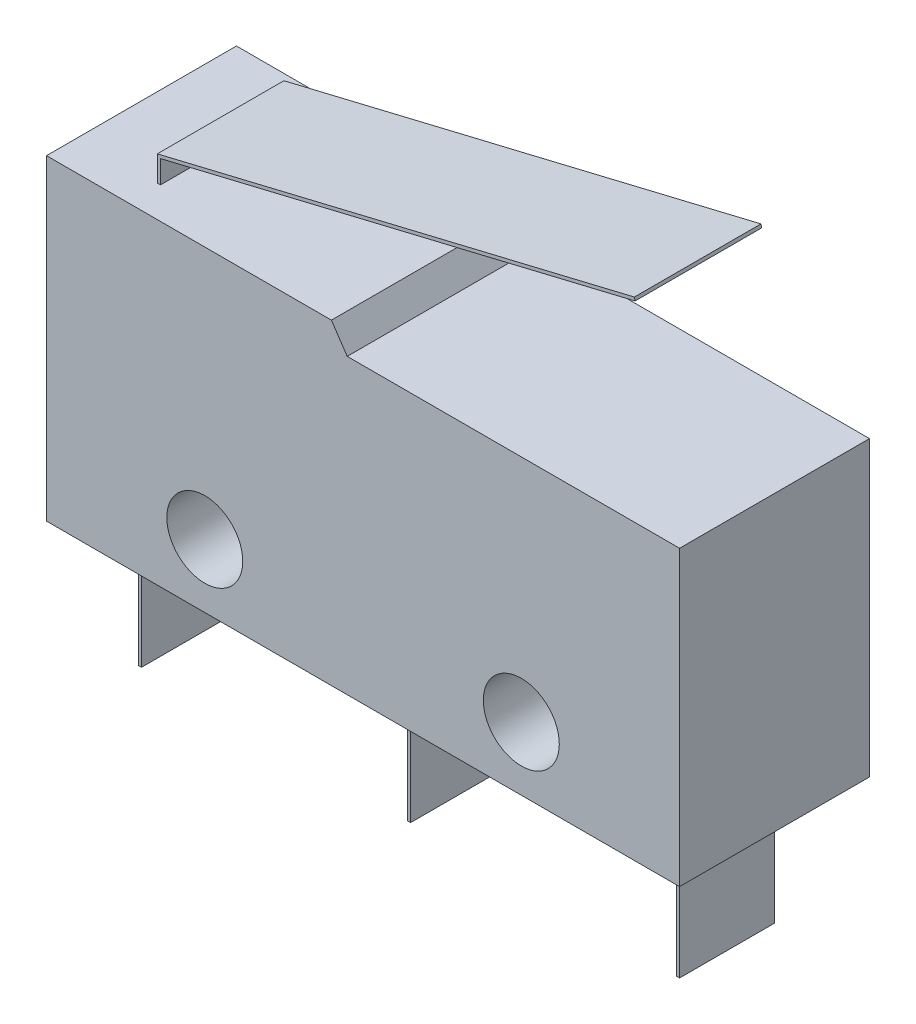
ISO-10303-21;
HEADER;
FILE_DESCRIPTION(('STEP AP214'),'2;1');
FILE_NAME('part.step','',(''),(''),'','','');
FILE_SCHEMA(('AUTOMOTIVE_DESIGN { 1 0 10303 214 1 1 1 1 }'));
ENDSEC;
DATA;
#1=APPLICATION_CONTEXT('core data for automotive mechanical design processes');
#2=APPLICATION_PROTOCOL_DEFINITION('international standard','automotive_design',2000,#1);
#3=PRODUCT_CONTEXT('',#1,'mechanical');
#4=PRODUCT('Part','Part','',(#3));
#5=PRODUCT_RELATED_PRODUCT_CATEGORY('part','',(#4));
#6=PRODUCT_DEFINITION_FORMATION('','',#4);
#7=PRODUCT_DEFINITION_CONTEXT('part definition',#1,'design');
#8=PRODUCT_DEFINITION('design','',#6,#7);
#9=PRODUCT_DEFINITION_SHAPE('','',#8);
#10=(LENGTH_UNIT() NAMED_UNIT(*) SI_UNIT(.MILLI.,.METRE.));
#11=(NAMED_UNIT(*) PLANE_ANGLE_UNIT() SI_UNIT($,.RADIAN.));
#12=(NAMED_UNIT(*) SI_UNIT($,.STERADIAN.) SOLID_ANGLE_UNIT());
#13=UNCERTAINTY_MEASURE_WITH_UNIT(LENGTH_MEASURE(1.E-05),#10,'distance_accuracy_value','');
#14=(GEOMETRIC_REPRESENTATION_CONTEXT(3) GLOBAL_UNCERTAINTY_ASSIGNED_CONTEXT((#13)) GLOBAL_UNIT_ASSIGNED_CONTEXT((#10,
#11,#12)) REPRESENTATION_CONTEXT('',''));
#15=CARTESIAN_POINT('',(0.,0.,0.));
#16=DIRECTION('',(0.,0.,1.));
#17=DIRECTION('',(1.,0.,0.));
#18=AXIS2_PLACEMENT_3D('',#15,#16,#17);
#19=CARTESIAN_POINT('',(0.,-5.,6.));
#20=DIRECTION('',(0.,1.,0.));
#21=DIRECTION('',(0.,0.,1.));
#22=AXIS2_PLACEMENT_3D('',#19,#20,#21);
#23=PLANE('',#22);
#24=DIRECTION('',(0.,0.,1.));
#25=VECTOR('',#24,1.);
#26=CARTESIAN_POINT('',(8.40000000000001,-5.,4.5));
#27=LINE('',#26,#25);
#28=CARTESIAN_POINT('',(8.40000000000001,-5.,4.5));
#29=VERTEX_POINT('',#28);
#30=CARTESIAN_POINT('',(8.40000000000001,-5.,1.5));
#31=VERTEX_POINT('',#30);
#32=EDGE_CURVE('E257',#29,#31,#27,.F.);
#33=ORIENTED_EDGE('',*,*,#32,.F.);
#34=DIRECTION('',(1.,0.,0.));
#35=VECTOR('',#34,1.);
#36=CARTESIAN_POINT('',(8.40000000000001,-5.,4.5));
#37=LINE('',#36,#35);
#38=CARTESIAN_POINT('',(8.50000000000001,-5.,4.5));
#39=VERTEX_POINT('',#38);
#40=EDGE_CURVE('E247',#29,#39,#37,.T.);
#41=ORIENTED_EDGE('',*,*,#40,.T.);
#42=DIRECTION('',(0.,0.,-1.));
#43=VECTOR('',#42,1.);
#44=CARTESIAN_POINT('',(8.50000000000001,-5.,4.5));
#45=LINE('',#44,#43);
#46=CARTESIAN_POINT('',(8.50000000000001,-5.,1.5));
#47=VERTEX_POINT('',#46);
#48=EDGE_CURVE('E65',#39,#47,#45,.T.);
#49=ORIENTED_EDGE('',*,*,#48,.T.);
#50=DIRECTION('',(-1.,0.,0.));
#51=VECTOR('',#50,1.);
#52=CARTESIAN_POINT('',(8.50000000000001,-5.,1.5));
#53=LINE('',#52,#51);
#54=EDGE_CURVE('E260',#47,#31,#53,.T.);
#55=ORIENTED_EDGE('',*,*,#54,.T.);
#56=EDGE_LOOP('',(#33,#41,#49,#55));
#57=FACE_BOUND('',#56,.T.);
#58=DIRECTION('',(1.,0.,0.));
#59=VECTOR('',#58,1.);
#60=CARTESIAN_POINT('',(0.,-5.,0.));
#61=LINE('',#60,#59);
#62=CARTESIAN_POINT('',(-10.,-5.,0.));
#63=VERTEX_POINT('',#62);
#64=CARTESIAN_POINT('',(9.99999999999999,-5.,0.));
#65=VERTEX_POINT('',#64);
#66=EDGE_CURVE('E392',#63,#65,#61,.T.);
#67=ORIENTED_EDGE('',*,*,#66,.T.);
#68=DIRECTION('',(0.,0.,-1.));
#69=VECTOR('',#68,1.);
#70=CARTESIAN_POINT('',(9.99999999999999,-5.,6.));
#71=LINE('',#70,#69);
#72=CARTESIAN_POINT('',(9.99999999999999,-5.,6.));
#73=VERTEX_POINT('',#72);
#74=EDGE_CURVE('E398',#73,#65,#71,.T.);
#75=ORIENTED_EDGE('',*,*,#74,.F.);
#76=DIRECTION('',(1.,0.,0.));
#77=VECTOR('',#76,1.);
#78=CARTESIAN_POINT('',(0.,-5.,6.));
#79=LINE('',#78,#77);
#80=CARTESIAN_POINT('',(-10.,-5.,6.));
#81=VERTEX_POINT('',#80);
#82=EDGE_CURVE('E369',#81,#73,#79,.T.);
#83=ORIENTED_EDGE('',*,*,#82,.F.);
#84=DIRECTION('',(0.,0.,-1.));
#85=VECTOR('',#84,1.);
#86=CARTESIAN_POINT('',(-10.,-5.,6.));
#87=LINE('',#86,#85);
#88=EDGE_CURVE('E400',#81,#63,#87,.T.);
#89=ORIENTED_EDGE('',*,*,#88,.T.);
#90=EDGE_LOOP('',(#67,#75,#83,#89));
#91=FACE_BOUND('',#90,.T.);
#92=DIRECTION('',(0.,0.,1.));
#93=VECTOR('',#92,1.);
#94=CARTESIAN_POINT('',(-0.1,-5.,4.5));
#95=LINE('',#94,#93);
#96=CARTESIAN_POINT('',(-0.1,-5.,4.5));
#97=VERTEX_POINT('',#96);
#98=CARTESIAN_POINT('',(-0.1,-5.,1.5));
#99=VERTEX_POINT('',#98);
#100=EDGE_CURVE('E286',#97,#99,#95,.F.);
#101=ORIENTED_EDGE('',*,*,#100,.F.);
#102=DIRECTION('',(1.,0.,0.));
#103=VECTOR('',#102,1.);
#104=CARTESIAN_POINT('',(-0.1,-5.,4.5));
#105=LINE('',#104,#103);
#106=CARTESIAN_POINT('',(0.,-5.,4.5));
#107=VERTEX_POINT('',#106);
#108=EDGE_CURVE('E276',#97,#107,#105,.T.);
#109=ORIENTED_EDGE('',*,*,#108,.T.);
#110=DIRECTION('',(0.,0.,-1.));
#111=VECTOR('',#110,1.);
#112=CARTESIAN_POINT('',(0.,-5.,4.5));
#113=LINE('',#112,#111);
#114=CARTESIAN_POINT('',(0.,-5.,1.5));
#115=VERTEX_POINT('',#114);
#116=EDGE_CURVE('E292',#107,#115,#113,.T.);
#117=ORIENTED_EDGE('',*,*,#116,.T.);
#118=DIRECTION('',(-1.,0.,0.));
#119=VECTOR('',#118,1.);
#120=CARTESIAN_POINT('',(0.,-5.,1.5));
#121=LINE('',#120,#119);
#122=EDGE_CURVE('E289',#115,#99,#121,.T.);
#123=ORIENTED_EDGE('',*,*,#122,.T.);
#124=EDGE_LOOP('',(#101,#109,#117,#123));
#125=FACE_BOUND('',#124,.T.);
#126=DIRECTION('',(0.,0.,1.));
#127=VECTOR('',#126,1.);
#128=CARTESIAN_POINT('',(-8.60000000000001,-5.,4.5));
#129=LINE('',#128,#127);
#130=CARTESIAN_POINT('',(-8.60000000000001,-5.,4.5));
#131=VERTEX_POINT('',#130);
#132=CARTESIAN_POINT('',(-8.60000000000001,-5.,1.5));
#133=VERTEX_POINT('',#132);
#134=EDGE_CURVE('E219',#131,#133,#129,.F.);
#135=ORIENTED_EDGE('',*,*,#134,.F.);
#136=DIRECTION('',(1.,0.,0.));
#137=VECTOR('',#136,1.);
#138=CARTESIAN_POINT('',(-8.60000000000001,-5.,4.5));
#139=LINE('',#138,#137);
#140=CARTESIAN_POINT('',(-8.50000000000001,-5.,4.5));
#141=VERTEX_POINT('',#140);
#142=EDGE_CURVE('E213',#131,#141,#139,.T.);
#143=ORIENTED_EDGE('',*,*,#142,.T.);
#144=DIRECTION('',(0.,0.,-1.));
#145=VECTOR('',#144,1.);
#146=CARTESIAN_POINT('',(-8.50000000000001,-5.,4.5));
#147=LINE('',#146,#145);
#148=CARTESIAN_POINT('',(-8.50000000000001,-5.,1.5));
#149=VERTEX_POINT('',#148);
#150=EDGE_CURVE('E57',#141,#149,#147,.T.);
#151=ORIENTED_EDGE('',*,*,#150,.T.);
#152=DIRECTION('',(-1.,0.,0.));
#153=VECTOR('',#152,1.);
#154=CARTESIAN_POINT('',(-8.50000000000001,-5.,1.5));
#155=LINE('',#154,#153);
#156=EDGE_CURVE('E234',#149,#133,#155,.T.);
#157=ORIENTED_EDGE('',*,*,#156,.T.);
#158=EDGE_LOOP('',(#135,#143,#151,#157));
#159=FACE_BOUND('',#158,.T.);
#160=ADVANCED_FACE('F42',(#57,#91,#125,#159),#23,.F.);
#161=CARTESIAN_POINT('',(0.,4.25831424670506,6.));
#162=DIRECTION('',(0.,1.,0.));
#163=DIRECTION('',(-1.,0.,0.));
#164=AXIS2_PLACEMENT_3D('',#161,#162,#163);
#165=PLANE('',#164);
#166=DIRECTION('',(1.,0.,0.));
#167=VECTOR('',#166,1.);
#168=CARTESIAN_POINT('',(0.,4.25831424670506,0.));
#169=LINE('',#168,#167);
#170=CARTESIAN_POINT('',(-0.499999999999999,4.25831424670506,0.));
#171=VERTEX_POINT('',#170);
#172=CARTESIAN_POINT('',(9.99999999999999,4.25831424670506,0.));
#173=VERTEX_POINT('',#172);
#174=EDGE_CURVE('E380',#171,#173,#169,.T.);
#175=ORIENTED_EDGE('',*,*,#174,.F.);
#176=DIRECTION('',(0.,0.,-1.));
#177=VECTOR('',#176,1.);
#178=CARTESIAN_POINT('',(-0.499999999999999,4.25831424670506,6.));
#179=LINE('',#178,#177);
#180=CARTESIAN_POINT('',(-0.499999999999999,4.25831424670506,6.));
#181=VERTEX_POINT('',#180);
#182=EDGE_CURVE('E11',#181,#171,#179,.T.);
#183=ORIENTED_EDGE('',*,*,#182,.F.);
#184=DIRECTION('',(1.,0.,0.));
#185=VECTOR('',#184,1.);
#186=CARTESIAN_POINT('',(0.,4.25831424670506,6.));
#187=LINE('',#186,#185);
#188=CARTESIAN_POINT('',(9.99999999999999,4.25831424670506,6.));
#189=VERTEX_POINT('',#188);
#190=EDGE_CURVE('E357',#181,#189,#187,.T.);
#191=ORIENTED_EDGE('',*,*,#190,.T.);
#192=DIRECTION('',(0.,0.,-1.));
#193=VECTOR('',#192,1.);
#194=CARTESIAN_POINT('',(9.99999999999999,4.25831424670506,6.));
#195=LINE('',#194,#193);
#196=EDGE_CURVE('E374',#189,#173,#195,.T.);
#197=ORIENTED_EDGE('',*,*,#196,.T.);
#198=EDGE_LOOP('',(#175,#183,#191,#197));
#199=FACE_BOUND('',#198,.T.);
#200=ADVANCED_FACE('F425',(#199),#165,.T.);
#201=CARTESIAN_POINT('',(1.6299466106144,1.09881213396196,6.));
#202=DIRECTION('',(0.829179221593346,0.558982842740145,0.));
#203=DIRECTION('',(-0.558982842740145,0.829179221593346,0.));
#204=AXIS2_PLACEMENT_3D('',#201,#202,#203);
#205=PLANE('',#204);
#206=DIRECTION('',(0.558982842740145,-0.829179221593346,0.));
#207=VECTOR('',#206,1.);
#208=CARTESIAN_POINT('',(1.6299466106144,1.09881213396196,0.));
#209=LINE('',#208,#207);
#210=CARTESIAN_POINT('',(-0.999999999999999,5.,0.));
#211=VERTEX_POINT('',#210);
#212=EDGE_CURVE('E383',#211,#171,#209,.T.);
#213=ORIENTED_EDGE('',*,*,#212,.F.);
#214=DIRECTION('',(0.,0.,-1.));
#215=VECTOR('',#214,1.);
#216=CARTESIAN_POINT('',(-0.999999999999999,5.,6.));
#217=LINE('',#216,#215);
#218=CARTESIAN_POINT('',(-0.999999999999999,5.,6.));
#219=VERTEX_POINT('',#218);
#220=EDGE_CURVE('E50',#219,#211,#217,.T.);
#221=ORIENTED_EDGE('',*,*,#220,.F.);
#222=DIRECTION('',(0.558982842740145,-0.829179221593346,0.));
#223=VECTOR('',#222,1.);
#224=CARTESIAN_POINT('',(1.6299466106144,1.09881213396196,6.));
#225=LINE('',#224,#223);
#226=EDGE_CURVE('E360',#219,#181,#225,.T.);
#227=ORIENTED_EDGE('',*,*,#226,.T.);
#228=ORIENTED_EDGE('',*,*,#182,.T.);
#229=EDGE_LOOP('',(#213,#221,#227,#228));
#230=FACE_BOUND('',#229,.T.);
#231=ADVANCED_FACE('F411',(#230),#205,.T.);
#232=CARTESIAN_POINT('',(0.,5.,6.));
#233=DIRECTION('',(0.,1.,0.));
#234=DIRECTION('',(0.,0.,1.));
#235=AXIS2_PLACEMENT_3D('',#232,#233,#234);
#236=PLANE('',#235);
#237=DIRECTION('',(-1.,0.,0.));
#238=VECTOR('',#237,1.);
#239=CARTESIAN_POINT('',(-7.40000000000001,5.,1.));
#240=LINE('',#239,#238);
#241=CARTESIAN_POINT('',(-7.40000000000001,5.,1.));
#242=VERTEX_POINT('',#241);
#243=CARTESIAN_POINT('',(-7.50000000000001,5.,1.));
#244=VERTEX_POINT('',#243);
#245=EDGE_CURVE('E314',#242,#244,#240,.T.);
#246=ORIENTED_EDGE('',*,*,#245,.F.);
#247=DIRECTION('',(0.,0.,1.));
#248=VECTOR('',#247,1.);
#249=CARTESIAN_POINT('',(-7.40000000000001,5.,1.));
#250=LINE('',#249,#248);
#251=CARTESIAN_POINT('',(-7.40000000000001,5.,5.));
#252=VERTEX_POINT('',#251);
#253=EDGE_CURVE('E337',#242,#252,#250,.T.);
#254=ORIENTED_EDGE('',*,*,#253,.T.);
#255=DIRECTION('',(-1.,0.,0.));
#256=VECTOR('',#255,1.);
#257=CARTESIAN_POINT('',(-7.40000000000001,5.,5.));
#258=LINE('',#257,#256);
#259=CARTESIAN_POINT('',(-7.50000000000001,5.,5.));
#260=VERTEX_POINT('',#259);
#261=EDGE_CURVE('E329',#252,#260,#258,.T.);
#262=ORIENTED_EDGE('',*,*,#261,.T.);
#263=DIRECTION('',(0.,0.,1.));
#264=VECTOR('',#263,1.);
#265=CARTESIAN_POINT('',(-7.50000000000001,5.,1.));
#266=LINE('',#265,#264);
#267=EDGE_CURVE('E340',#244,#260,#266,.T.);
#268=ORIENTED_EDGE('',*,*,#267,.F.);
#269=EDGE_LOOP('',(#246,#254,#262,#268));
#270=FACE_BOUND('',#269,.T.);
#271=DIRECTION('',(1.,0.,0.));
#272=VECTOR('',#271,1.);
#273=CARTESIAN_POINT('',(0.,5.,0.));
#274=LINE('',#273,#272);
#275=CARTESIAN_POINT('',(-10.,5.,0.));
#276=VERTEX_POINT('',#275);
#277=EDGE_CURVE('E386',#276,#211,#274,.T.);
#278=ORIENTED_EDGE('',*,*,#277,.F.);
#279=DIRECTION('',(0.,0.,-1.));
#280=VECTOR('',#279,1.);
#281=CARTESIAN_POINT('',(-10.,5.,6.));
#282=LINE('',#281,#280);
#283=CARTESIAN_POINT('',(-10.,5.,6.));
#284=VERTEX_POINT('',#283);
#285=EDGE_CURVE('E403',#284,#276,#282,.T.);
#286=ORIENTED_EDGE('',*,*,#285,.F.);
#287=DIRECTION('',(1.,0.,0.));
#288=VECTOR('',#287,1.);
#289=CARTESIAN_POINT('',(0.,5.,6.));
#290=LINE('',#289,#288);
#291=EDGE_CURVE('E363',#284,#219,#290,.T.);
#292=ORIENTED_EDGE('',*,*,#291,.T.);
#293=ORIENTED_EDGE('',*,*,#220,.T.);
#294=EDGE_LOOP('',(#278,#286,#292,#293));
#295=FACE_BOUND('',#294,.T.);
#296=ADVANCED_FACE('F407',(#270,#295),#236,.T.);
#297=CARTESIAN_POINT('',(-10.,0.,6.));
#298=DIRECTION('',(1.,0.,0.));
#299=DIRECTION('',(0.,1.,0.));
#300=AXIS2_PLACEMENT_3D('',#297,#298,#299);
#301=PLANE('',#300);
#302=DIRECTION('',(0.,-1.,0.));
#303=VECTOR('',#302,1.);
#304=CARTESIAN_POINT('',(-10.,0.,0.));
#305=LINE('',#304,#303);
#306=EDGE_CURVE('E389',#276,#63,#305,.T.);
#307=ORIENTED_EDGE('',*,*,#306,.T.);
#308=ORIENTED_EDGE('',*,*,#88,.F.);
#309=DIRECTION('',(0.,-1.,0.));
#310=VECTOR('',#309,1.);
#311=CARTESIAN_POINT('',(-10.,0.,6.));
#312=LINE('',#311,#310);
#313=EDGE_CURVE('E366',#284,#81,#312,.T.);
#314=ORIENTED_EDGE('',*,*,#313,.F.);
#315=ORIENTED_EDGE('',*,*,#285,.T.);
#316=EDGE_LOOP('',(#307,#308,#314,#315));
#317=FACE_BOUND('',#316,.T.);
#318=ADVANCED_FACE('F418',(#317),#301,.F.);
#319=CARTESIAN_POINT('',(-5.,-3.,6.));
#320=DIRECTION('',(0.,0.,-1.));
#321=DIRECTION('',(-1.,0.,0.));
#322=AXIS2_PLACEMENT_3D('',#319,#320,#321);
#323=CYLINDRICAL_SURFACE('',#322,1.2);
#324=CARTESIAN_POINT('',(-5.,-3.,6.));
#325=DIRECTION('',(0.,0.,1.));
#326=DIRECTION('',(1.,0.,0.));
#327=AXIS2_PLACEMENT_3D('',#324,#325,#326);
#328=CIRCLE('',#327,1.2);
#329=CARTESIAN_POINT('',(-3.8,-3.,6.));
#330=VERTEX_POINT('',#329);
#331=EDGE_CURVE('E353',#330,#330,#328,.T.);
#332=ORIENTED_EDGE('',*,*,#331,.T.);
#333=EDGE_LOOP('',(#332));
#334=FACE_BOUND('',#333,.T.);
#335=CARTESIAN_POINT('',(-5.,-3.,0.));
#336=DIRECTION('',(0.,0.,1.));
#337=DIRECTION('',(1.,0.,0.));
#338=AXIS2_PLACEMENT_3D('',#335,#336,#337);
#339=CIRCLE('',#338,1.2);
#340=CARTESIAN_POINT('',(-3.8,-3.,0.));
#341=VERTEX_POINT('',#340);
#342=EDGE_CURVE('E377',#341,#341,#339,.T.);
#343=ORIENTED_EDGE('',*,*,#342,.F.);
#344=EDGE_LOOP('',(#343));
#345=FACE_BOUND('',#344,.T.);
#346=ADVANCED_FACE('F530',(#334,#345),#323,.F.);
#347=CARTESIAN_POINT('',(5.,-3.,6.));
#348=DIRECTION('',(0.,0.,-1.));
#349=DIRECTION('',(-1.,0.,0.));
#350=AXIS2_PLACEMENT_3D('',#347,#348,#349);
#351=CYLINDRICAL_SURFACE('',#350,1.2);
#352=CARTESIAN_POINT('',(5.,-3.,6.));
#353=DIRECTION('',(0.,0.,1.));
#354=DIRECTION('',(1.,0.,0.));
#355=AXIS2_PLACEMENT_3D('',#352,#353,#354);
#356=CIRCLE('',#355,1.2);
#357=CARTESIAN_POINT('',(6.2,-3.,6.));
#358=VERTEX_POINT('',#357);
#359=EDGE_CURVE('E350',#358,#358,#356,.T.);
#360=ORIENTED_EDGE('',*,*,#359,.T.);
#361=EDGE_LOOP('',(#360));
#362=FACE_BOUND('',#361,.T.);
#363=CARTESIAN_POINT('',(5.,-3.,0.));
#364=DIRECTION('',(0.,0.,1.));
#365=DIRECTION('',(1.,0.,0.));
#366=AXIS2_PLACEMENT_3D('',#363,#364,#365);
#367=CIRCLE('',#366,1.2);
#368=CARTESIAN_POINT('',(6.2,-3.,0.));
#369=VERTEX_POINT('',#368);
#370=EDGE_CURVE('E336',#369,#369,#367,.T.);
#371=ORIENTED_EDGE('',*,*,#370,.F.);
#372=EDGE_LOOP('',(#371));
#373=FACE_BOUND('',#372,.T.);
#374=ADVANCED_FACE('F44',(#362,#373),#351,.F.);
#375=CARTESIAN_POINT('',(9.99999999999999,0.,6.));
#376=DIRECTION('',(1.,0.,0.));
#377=DIRECTION('',(0.,1.,0.));
#378=AXIS2_PLACEMENT_3D('',#375,#376,#377);
#379=PLANE('',#378);
#380=DIRECTION('',(0.,-1.,0.));
#381=VECTOR('',#380,1.);
#382=CARTESIAN_POINT('',(9.99999999999999,0.,0.));
#383=LINE('',#382,#381);
#384=EDGE_CURVE('E354',#173,#65,#383,.T.);
#385=ORIENTED_EDGE('',*,*,#384,.F.);
#386=ORIENTED_EDGE('',*,*,#196,.F.);
#387=DIRECTION('',(0.,-1.,0.));
#388=VECTOR('',#387,1.);
#389=CARTESIAN_POINT('',(9.99999999999999,0.,6.));
#390=LINE('',#389,#388);
#391=EDGE_CURVE('E371',#189,#73,#390,.T.);
#392=ORIENTED_EDGE('',*,*,#391,.T.);
#393=ORIENTED_EDGE('',*,*,#74,.T.);
#394=EDGE_LOOP('',(#385,#386,#392,#393));
#395=FACE_BOUND('',#394,.T.);
#396=ADVANCED_FACE('F428',(#395),#379,.T.);
#397=CARTESIAN_POINT('',(0.,0.,6.));
#398=DIRECTION('',(0.,0.,1.));
#399=DIRECTION('',(1.,0.,0.));
#400=AXIS2_PLACEMENT_3D('',#397,#398,#399);
#401=PLANE('',#400);
#402=ORIENTED_EDGE('',*,*,#359,.F.);
#403=EDGE_LOOP('',(#402));
#404=FACE_BOUND('',#403,.T.);
#405=ORIENTED_EDGE('',*,*,#331,.F.);
#406=EDGE_LOOP('',(#405));
#407=FACE_BOUND('',#406,.T.);
#408=ORIENTED_EDGE('',*,*,#190,.F.);
#409=ORIENTED_EDGE('',*,*,#226,.F.);
#410=ORIENTED_EDGE('',*,*,#291,.F.);
#411=ORIENTED_EDGE('',*,*,#313,.T.);
#412=ORIENTED_EDGE('',*,*,#82,.T.);
#413=ORIENTED_EDGE('',*,*,#391,.F.);
#414=EDGE_LOOP('',(#408,#409,#410,#411,#412,#413));
#415=FACE_BOUND('',#414,.T.);
#416=ADVANCED_FACE('F422',(#404,#407,#415),#401,.T.);
#417=CARTESIAN_POINT('',(0.,0.,0.));
#418=DIRECTION('',(0.,0.,1.));
#419=DIRECTION('',(1.,0.,0.));
#420=AXIS2_PLACEMENT_3D('',#417,#418,#419);
#421=PLANE('',#420);
#422=ORIENTED_EDGE('',*,*,#370,.T.);
#423=EDGE_LOOP('',(#422));
#424=FACE_BOUND('',#423,.T.);
#425=ORIENTED_EDGE('',*,*,#342,.T.);
#426=EDGE_LOOP('',(#425));
#427=FACE_BOUND('',#426,.T.);
#428=ORIENTED_EDGE('',*,*,#174,.T.);
#429=ORIENTED_EDGE('',*,*,#384,.T.);
#430=ORIENTED_EDGE('',*,*,#66,.F.);
#431=ORIENTED_EDGE('',*,*,#306,.F.);
#432=ORIENTED_EDGE('',*,*,#277,.T.);
#433=ORIENTED_EDGE('',*,*,#212,.T.);
#434=EDGE_LOOP('',(#428,#429,#430,#431,#432,#433));
#435=FACE_BOUND('',#434,.T.);
#436=ADVANCED_FACE('F415',(#424,#427,#435),#421,.F.);
#437=CARTESIAN_POINT('',(-7.47665546361442,5.70276300796024,1.));
#438=DIRECTION('',(0.233445363855899,-0.972369920397678,0.));
#439=DIRECTION('',(0.972369920397678,0.233445363855899,0.));
#440=AXIS2_PLACEMENT_3D('',#437,#438,#439);
#441=PLANE('',#440);
#442=DIRECTION('',(0.972369920397678,0.233445363855899,0.));
#443=VECTOR('',#442,1.);
#444=CARTESIAN_POINT('',(-7.47665546361442,5.70276300796024,5.));
#445=LINE('',#444,#443);
#446=CARTESIAN_POINT('',(-7.40000000000001,5.72116635654149,5.));
#447=VERTEX_POINT('',#446);
#448=CARTESIAN_POINT('',(7.59507830254959,9.32116614772667,5.));
#449=VERTEX_POINT('',#448);
#450=EDGE_CURVE('E223',#447,#449,#445,.T.);
#451=ORIENTED_EDGE('',*,*,#450,.F.);
#452=DIRECTION('',(0.,0.,1.));
#453=VECTOR('',#452,1.);
#454=CARTESIAN_POINT('',(-7.40000000000001,5.72116635654149,1.));
#455=LINE('',#454,#453);
#456=CARTESIAN_POINT('',(-7.40000000000001,5.72116635654149,1.));
#457=VERTEX_POINT('',#456);
#458=EDGE_CURVE('E334',#457,#447,#455,.T.);
#459=ORIENTED_EDGE('',*,*,#458,.F.);
#460=DIRECTION('',(0.972369920397678,0.233445363855899,0.));
#461=VECTOR('',#460,1.);
#462=CARTESIAN_POINT('',(-7.47665546361442,5.70276300796024,1.));
#463=LINE('',#462,#461);
#464=CARTESIAN_POINT('',(7.59507830254959,9.32116614772667,1.));
#465=VERTEX_POINT('',#464);
#466=EDGE_CURVE('E304',#457,#465,#463,.T.);
#467=ORIENTED_EDGE('',*,*,#466,.T.);
#468=DIRECTION('',(0.,0.,1.));
#469=VECTOR('',#468,1.);
#470=CARTESIAN_POINT('',(7.59507830254959,9.32116614772667,1.));
#471=LINE('',#470,#469);
#472=EDGE_CURVE('E319',#465,#449,#471,.T.);
#473=ORIENTED_EDGE('',*,*,#472,.T.);
#474=EDGE_LOOP('',(#451,#459,#467,#473));
#475=FACE_BOUND('',#474,.T.);
#476=ADVANCED_FACE('F505',(#475),#441,.T.);
#477=CARTESIAN_POINT('',(-7.40000000000001,5.,1.));
#478=DIRECTION('',(1.,0.,0.));
#479=DIRECTION('',(0.,1.,0.));
#480=AXIS2_PLACEMENT_3D('',#477,#478,#479);
#481=PLANE('',#480);
#482=DIRECTION('',(0.,1.,0.));
#483=VECTOR('',#482,1.);
#484=CARTESIAN_POINT('',(-7.40000000000001,5.,5.));
#485=LINE('',#484,#483);
#486=EDGE_CURVE('E308',#252,#447,#485,.T.);
#487=ORIENTED_EDGE('',*,*,#486,.F.);
#488=ORIENTED_EDGE('',*,*,#253,.F.);
#489=DIRECTION('',(0.,1.,0.));
#490=VECTOR('',#489,1.);
#491=CARTESIAN_POINT('',(-7.40000000000001,5.,1.));
#492=LINE('',#491,#490);
#493=EDGE_CURVE('E316',#242,#457,#492,.T.);
#494=ORIENTED_EDGE('',*,*,#493,.T.);
#495=ORIENTED_EDGE('',*,*,#458,.T.);
#496=EDGE_LOOP('',(#487,#488,#494,#495));
#497=FACE_BOUND('',#496,.T.);
#498=ADVANCED_FACE('F501',(#497),#481,.T.);
#499=CARTESIAN_POINT('',(-7.50000000000001,5.,1.));
#500=DIRECTION('',(1.,0.,0.));
#501=DIRECTION('',(0.,1.,0.));
#502=AXIS2_PLACEMENT_3D('',#499,#500,#501);
#503=PLANE('',#502);
#504=DIRECTION('',(0.,1.,0.));
#505=VECTOR('',#504,1.);
#506=CARTESIAN_POINT('',(-7.50000000000001,5.,5.));
#507=LINE('',#506,#505);
#508=CARTESIAN_POINT('',(-7.50000000000001,5.8,5.));
#509=VERTEX_POINT('',#508);
#510=EDGE_CURVE('E327',#260,#509,#507,.T.);
#511=ORIENTED_EDGE('',*,*,#510,.T.);
#512=DIRECTION('',(0.,0.,1.));
#513=VECTOR('',#512,1.);
#514=CARTESIAN_POINT('',(-7.50000000000001,5.8,1.));
#515=LINE('',#514,#513);
#516=CARTESIAN_POINT('',(-7.50000000000001,5.8,1.));
#517=VERTEX_POINT('',#516);
#518=EDGE_CURVE('E343',#517,#509,#515,.T.);
#519=ORIENTED_EDGE('',*,*,#518,.F.);
#520=DIRECTION('',(0.,1.,0.));
#521=VECTOR('',#520,1.);
#522=CARTESIAN_POINT('',(-7.50000000000001,5.,1.));
#523=LINE('',#522,#521);
#524=EDGE_CURVE('E312',#244,#517,#523,.T.);
#525=ORIENTED_EDGE('',*,*,#524,.F.);
#526=ORIENTED_EDGE('',*,*,#267,.T.);
#527=EDGE_LOOP('',(#511,#519,#525,#526));
#528=FACE_BOUND('',#527,.T.);
#529=ADVANCED_FACE('F504',(#528),#503,.F.);
#530=CARTESIAN_POINT('',(-7.50000000000001,5.8,1.));
#531=DIRECTION('',(0.233445363855899,-0.972369920397678,0.));
#532=DIRECTION('',(0.972369920397678,0.233445363855899,0.));
#533=AXIS2_PLACEMENT_3D('',#530,#531,#532);
#534=PLANE('',#533);
#535=DIRECTION('',(0.972369920397678,0.233445363855899,0.));
#536=VECTOR('',#535,1.);
#537=CARTESIAN_POINT('',(-7.50000000000001,5.8,5.));
#538=LINE('',#537,#536);
#539=CARTESIAN_POINT('',(7.571733766164,9.41840313976644,5.));
#540=VERTEX_POINT('',#539);
#541=EDGE_CURVE('E325',#509,#540,#538,.T.);
#542=ORIENTED_EDGE('',*,*,#541,.T.);
#543=DIRECTION('',(0.,0.,1.));
#544=VECTOR('',#543,1.);
#545=CARTESIAN_POINT('',(7.571733766164,9.41840313976644,1.));
#546=LINE('',#545,#544);
#547=CARTESIAN_POINT('',(7.571733766164,9.41840313976644,1.));
#548=VERTEX_POINT('',#547);
#549=EDGE_CURVE('E346',#548,#540,#546,.T.);
#550=ORIENTED_EDGE('',*,*,#549,.F.);
#551=DIRECTION('',(0.972369920397678,0.233445363855899,0.));
#552=VECTOR('',#551,1.);
#553=CARTESIAN_POINT('',(-7.50000000000001,5.8,1.));
#554=LINE('',#553,#552);
#555=EDGE_CURVE('E310',#517,#548,#554,.T.);
#556=ORIENTED_EDGE('',*,*,#555,.F.);
#557=ORIENTED_EDGE('',*,*,#518,.T.);
#558=EDGE_LOOP('',(#542,#550,#556,#557));
#559=FACE_BOUND('',#558,.T.);
#560=ADVANCED_FACE('F509',(#559),#534,.F.);
#561=CARTESIAN_POINT('',(7.571733766164,9.41840313976644,1.));
#562=DIRECTION('',(-0.972369920397682,-0.233445363855884,0.));
#563=DIRECTION('',(0.233445363855884,-0.972369920397682,0.));
#564=AXIS2_PLACEMENT_3D('',#561,#562,#563);
#565=PLANE('',#564);
#566=DIRECTION('',(0.233445363855884,-0.972369920397682,0.));
#567=VECTOR('',#566,1.);
#568=CARTESIAN_POINT('',(7.571733766164,9.41840313976644,5.));
#569=LINE('',#568,#567);
#570=EDGE_CURVE('E322',#540,#449,#569,.T.);
#571=ORIENTED_EDGE('',*,*,#570,.T.);
#572=ORIENTED_EDGE('',*,*,#472,.F.);
#573=DIRECTION('',(0.233445363855884,-0.972369920397682,0.));
#574=VECTOR('',#573,1.);
#575=CARTESIAN_POINT('',(7.571733766164,9.41840313976644,1.));
#576=LINE('',#575,#574);
#577=EDGE_CURVE('E307',#548,#465,#576,.T.);
#578=ORIENTED_EDGE('',*,*,#577,.F.);
#579=ORIENTED_EDGE('',*,*,#549,.T.);
#580=EDGE_LOOP('',(#571,#572,#578,#579));
#581=FACE_BOUND('',#580,.T.);
#582=ADVANCED_FACE('F496',(#581),#565,.F.);
#583=CARTESIAN_POINT('',(0.,0.,1.));
#584=DIRECTION('',(0.,0.,-1.));
#585=DIRECTION('',(-1.,0.,0.));
#586=AXIS2_PLACEMENT_3D('',#583,#584,#585);
#587=PLANE('',#586);
#588=ORIENTED_EDGE('',*,*,#466,.F.);
#589=ORIENTED_EDGE('',*,*,#493,.F.);
#590=ORIENTED_EDGE('',*,*,#245,.T.);
#591=ORIENTED_EDGE('',*,*,#524,.T.);
#592=ORIENTED_EDGE('',*,*,#555,.T.);
#593=ORIENTED_EDGE('',*,*,#577,.T.);
#594=EDGE_LOOP('',(#588,#589,#590,#591,#592,#593));
#595=FACE_BOUND('',#594,.T.);
#596=ADVANCED_FACE('F493',(#595),#587,.T.);
#597=CARTESIAN_POINT('',(0.,0.,5.));
#598=DIRECTION('',(0.,0.,-1.));
#599=DIRECTION('',(-1.,0.,0.));
#600=AXIS2_PLACEMENT_3D('',#597,#598,#599);
#601=PLANE('',#600);
#602=ORIENTED_EDGE('',*,*,#450,.T.);
#603=ORIENTED_EDGE('',*,*,#570,.F.);
#604=ORIENTED_EDGE('',*,*,#541,.F.);
#605=ORIENTED_EDGE('',*,*,#510,.F.);
#606=ORIENTED_EDGE('',*,*,#261,.F.);
#607=ORIENTED_EDGE('',*,*,#486,.T.);
#608=EDGE_LOOP('',(#602,#603,#604,#605,#606,#607));
#609=FACE_BOUND('',#608,.T.);
#610=ADVANCED_FACE('F491',(#609),#601,.F.);
#611=CARTESIAN_POINT('',(-0.1,-9.,4.5));
#612=DIRECTION('',(1.,0.,0.));
#613=DIRECTION('',(0.,0.,-1.));
#614=AXIS2_PLACEMENT_3D('',#611,#612,#613);
#615=PLANE('',#614);
#616=ORIENTED_EDGE('',*,*,#100,.T.);
#617=DIRECTION('',(0.,1.,0.));
#618=VECTOR('',#617,1.);
#619=CARTESIAN_POINT('',(-0.1,-9.,1.5));
#620=LINE('',#619,#618);
#621=CARTESIAN_POINT('',(-0.1,-9.,1.5));
#622=VERTEX_POINT('',#621);
#623=EDGE_CURVE('E261',#622,#99,#620,.T.);
#624=ORIENTED_EDGE('',*,*,#623,.F.);
#625=DIRECTION('',(0.,0.,1.));
#626=VECTOR('',#625,1.);
#627=CARTESIAN_POINT('',(-0.1,-9.,4.5));
#628=LINE('',#627,#626);
#629=CARTESIAN_POINT('',(-0.1,-9.,4.5));
#630=VERTEX_POINT('',#629);
#631=EDGE_CURVE('E273',#630,#622,#628,.F.);
#632=ORIENTED_EDGE('',*,*,#631,.F.);
#633=DIRECTION('',(0.,1.,0.));
#634=VECTOR('',#633,1.);
#635=CARTESIAN_POINT('',(-0.1,-9.,4.5));
#636=LINE('',#635,#634);
#637=EDGE_CURVE('E285',#630,#97,#636,.T.);
#638=ORIENTED_EDGE('',*,*,#637,.T.);
#639=EDGE_LOOP('',(#616,#624,#632,#638));
#640=FACE_BOUND('',#639,.T.);
#641=ADVANCED_FACE('F487',(#640),#615,.F.);
#642=CARTESIAN_POINT('',(0.,-9.,1.5));
#643=DIRECTION('',(0.,0.,-1.));
#644=DIRECTION('',(-1.,0.,0.));
#645=AXIS2_PLACEMENT_3D('',#642,#643,#644);
#646=PLANE('',#645);
#647=ORIENTED_EDGE('',*,*,#122,.F.);
#648=DIRECTION('',(0.,1.,0.));
#649=VECTOR('',#648,1.);
#650=CARTESIAN_POINT('',(0.,-9.,1.5));
#651=LINE('',#650,#649);
#652=CARTESIAN_POINT('',(0.,-9.,1.5));
#653=VERTEX_POINT('',#652);
#654=EDGE_CURVE('E301',#653,#115,#651,.T.);
#655=ORIENTED_EDGE('',*,*,#654,.F.);
#656=DIRECTION('',(-1.,0.,0.));
#657=VECTOR('',#656,1.);
#658=CARTESIAN_POINT('',(0.,-9.,1.5));
#659=LINE('',#658,#657);
#660=EDGE_CURVE('E275',#653,#622,#659,.T.);
#661=ORIENTED_EDGE('',*,*,#660,.T.);
#662=ORIENTED_EDGE('',*,*,#623,.T.);
#663=EDGE_LOOP('',(#647,#655,#661,#662));
#664=FACE_BOUND('',#663,.T.);
#665=ADVANCED_FACE('F483',(#664),#646,.T.);
#666=CARTESIAN_POINT('',(0.,-9.,4.5));
#667=DIRECTION('',(1.,0.,0.));
#668=DIRECTION('',(0.,0.,-1.));
#669=AXIS2_PLACEMENT_3D('',#666,#667,#668);
#670=PLANE('',#669);
#671=ORIENTED_EDGE('',*,*,#116,.F.);
#672=DIRECTION('',(0.,1.,0.));
#673=VECTOR('',#672,1.);
#674=CARTESIAN_POINT('',(0.,-9.,4.5));
#675=LINE('',#674,#673);
#676=CARTESIAN_POINT('',(0.,-9.,4.5));
#677=VERTEX_POINT('',#676);
#678=EDGE_CURVE('E298',#677,#107,#675,.T.);
#679=ORIENTED_EDGE('',*,*,#678,.F.);
#680=DIRECTION('',(0.,0.,-1.));
#681=VECTOR('',#680,1.);
#682=CARTESIAN_POINT('',(0.,-9.,4.5));
#683=LINE('',#682,#681);
#684=EDGE_CURVE('E279',#677,#653,#683,.T.);
#685=ORIENTED_EDGE('',*,*,#684,.T.);
#686=ORIENTED_EDGE('',*,*,#654,.T.);
#687=EDGE_LOOP('',(#671,#679,#685,#686));
#688=FACE_BOUND('',#687,.T.);
#689=ADVANCED_FACE('F479',(#688),#670,.T.);
#690=CARTESIAN_POINT('',(-0.1,-9.,4.5));
#691=DIRECTION('',(0.,0.,1.));
#692=DIRECTION('',(1.,0.,0.));
#693=AXIS2_PLACEMENT_3D('',#690,#691,#692);
#694=PLANE('',#693);
#695=ORIENTED_EDGE('',*,*,#108,.F.);
#696=ORIENTED_EDGE('',*,*,#637,.F.);
#697=DIRECTION('',(1.,0.,0.));
#698=VECTOR('',#697,1.);
#699=CARTESIAN_POINT('',(-0.1,-9.,4.5));
#700=LINE('',#699,#698);
#701=EDGE_CURVE('E282',#630,#677,#700,.T.);
#702=ORIENTED_EDGE('',*,*,#701,.T.);
#703=ORIENTED_EDGE('',*,*,#678,.T.);
#704=EDGE_LOOP('',(#695,#696,#702,#703));
#705=FACE_BOUND('',#704,.T.);
#706=ADVANCED_FACE('F475',(#705),#694,.T.);
#707=CARTESIAN_POINT('',(0.,-9.,0.));
#708=DIRECTION('',(0.,-1.,0.));
#709=DIRECTION('',(1.,0.,0.));
#710=AXIS2_PLACEMENT_3D('',#707,#708,#709);
#711=PLANE('',#710);
#712=ORIENTED_EDGE('',*,*,#631,.T.);
#713=ORIENTED_EDGE('',*,*,#660,.F.);
#714=ORIENTED_EDGE('',*,*,#684,.F.);
#715=ORIENTED_EDGE('',*,*,#701,.F.);
#716=EDGE_LOOP('',(#712,#713,#714,#715));
#717=FACE_BOUND('',#716,.T.);
#718=ADVANCED_FACE('F471',(#717),#711,.T.);
#719=CARTESIAN_POINT('',(8.40000000000001,-9.,4.5));
#720=DIRECTION('',(1.,0.,0.));
#721=DIRECTION('',(0.,0.,-1.));
#722=AXIS2_PLACEMENT_3D('',#719,#720,#721);
#723=PLANE('',#722);
#724=ORIENTED_EDGE('',*,*,#32,.T.);
#725=DIRECTION('',(0.,1.,0.));
#726=VECTOR('',#725,1.);
#727=CARTESIAN_POINT('',(8.40000000000001,-9.,1.5));
#728=LINE('',#727,#726);
#729=CARTESIAN_POINT('',(8.40000000000001,-9.,1.5));
#730=VERTEX_POINT('',#729);
#731=EDGE_CURVE('E235',#730,#31,#728,.T.);
#732=ORIENTED_EDGE('',*,*,#731,.F.);
#733=DIRECTION('',(0.,0.,1.));
#734=VECTOR('',#733,1.);
#735=CARTESIAN_POINT('',(8.40000000000001,-9.,4.5));
#736=LINE('',#735,#734);
#737=CARTESIAN_POINT('',(8.40000000000001,-9.,4.5));
#738=VERTEX_POINT('',#737);
#739=EDGE_CURVE('E244',#738,#730,#736,.F.);
#740=ORIENTED_EDGE('',*,*,#739,.F.);
#741=DIRECTION('',(0.,1.,0.));
#742=VECTOR('',#741,1.);
#743=CARTESIAN_POINT('',(8.40000000000001,-9.,4.5));
#744=LINE('',#743,#742);
#745=EDGE_CURVE('E256',#738,#29,#744,.T.);
#746=ORIENTED_EDGE('',*,*,#745,.T.);
#747=EDGE_LOOP('',(#724,#732,#740,#746));
#748=FACE_BOUND('',#747,.T.);
#749=ADVANCED_FACE('F467',(#748),#723,.F.);
#750=CARTESIAN_POINT('',(8.50000000000001,-9.,1.5));
#751=DIRECTION('',(0.,0.,-1.));
#752=DIRECTION('',(-1.,0.,0.));
#753=AXIS2_PLACEMENT_3D('',#750,#751,#752);
#754=PLANE('',#753);
#755=ORIENTED_EDGE('',*,*,#54,.F.);
#756=DIRECTION('',(0.,1.,0.));
#757=VECTOR('',#756,1.);
#758=CARTESIAN_POINT('',(8.50000000000001,-9.,1.5));
#759=LINE('',#758,#757);
#760=CARTESIAN_POINT('',(8.50000000000001,-9.,1.5));
#761=VERTEX_POINT('',#760);
#762=EDGE_CURVE('E270',#761,#47,#759,.T.);
#763=ORIENTED_EDGE('',*,*,#762,.F.);
#764=DIRECTION('',(-1.,0.,0.));
#765=VECTOR('',#764,1.);
#766=CARTESIAN_POINT('',(8.50000000000001,-9.,1.5));
#767=LINE('',#766,#765);
#768=EDGE_CURVE('E246',#761,#730,#767,.T.);
#769=ORIENTED_EDGE('',*,*,#768,.T.);
#770=ORIENTED_EDGE('',*,*,#731,.T.);
#771=EDGE_LOOP('',(#755,#763,#769,#770));
#772=FACE_BOUND('',#771,.T.);
#773=ADVANCED_FACE('F464',(#772),#754,.T.);
#774=CARTESIAN_POINT('',(8.50000000000001,-9.,4.5));
#775=DIRECTION('',(1.,0.,0.));
#776=DIRECTION('',(0.,0.,-1.));
#777=AXIS2_PLACEMENT_3D('',#774,#775,#776);
#778=PLANE('',#777);
#779=ORIENTED_EDGE('',*,*,#48,.F.);
#780=DIRECTION('',(0.,1.,0.));
#781=VECTOR('',#780,1.);
#782=CARTESIAN_POINT('',(8.50000000000001,-9.,4.5));
#783=LINE('',#782,#781);
#784=CARTESIAN_POINT('',(8.50000000000001,-9.,4.5));
#785=VERTEX_POINT('',#784);
#786=EDGE_CURVE('E268',#785,#39,#783,.T.);
#787=ORIENTED_EDGE('',*,*,#786,.F.);
#788=DIRECTION('',(0.,0.,-1.));
#789=VECTOR('',#788,1.);
#790=CARTESIAN_POINT('',(8.50000000000001,-9.,4.5));
#791=LINE('',#790,#789);
#792=EDGE_CURVE('E250',#785,#761,#791,.T.);
#793=ORIENTED_EDGE('',*,*,#792,.T.);
#794=ORIENTED_EDGE('',*,*,#762,.T.);
#795=EDGE_LOOP('',(#779,#787,#793,#794));
#796=FACE_BOUND('',#795,.T.);
#797=ADVANCED_FACE('F460',(#796),#778,.T.);
#798=CARTESIAN_POINT('',(8.40000000000001,-9.,4.5));
#799=DIRECTION('',(0.,0.,1.));
#800=DIRECTION('',(1.,0.,0.));
#801=AXIS2_PLACEMENT_3D('',#798,#799,#800);
#802=PLANE('',#801);
#803=ORIENTED_EDGE('',*,*,#40,.F.);
#804=ORIENTED_EDGE('',*,*,#745,.F.);
#805=DIRECTION('',(1.,0.,0.));
#806=VECTOR('',#805,1.);
#807=CARTESIAN_POINT('',(8.40000000000001,-9.,4.5));
#808=LINE('',#807,#806);
#809=EDGE_CURVE('E253',#738,#785,#808,.T.);
#810=ORIENTED_EDGE('',*,*,#809,.T.);
#811=ORIENTED_EDGE('',*,*,#786,.T.);
#812=EDGE_LOOP('',(#803,#804,#810,#811));
#813=FACE_BOUND('',#812,.T.);
#814=ADVANCED_FACE('F456',(#813),#802,.T.);
#815=CARTESIAN_POINT('',(0.,-9.,0.));
#816=DIRECTION('',(0.,-1.,0.));
#817=DIRECTION('',(1.,0.,0.));
#818=AXIS2_PLACEMENT_3D('',#815,#816,#817);
#819=PLANE('',#818);
#820=ORIENTED_EDGE('',*,*,#739,.T.);
#821=ORIENTED_EDGE('',*,*,#768,.F.);
#822=ORIENTED_EDGE('',*,*,#792,.F.);
#823=ORIENTED_EDGE('',*,*,#809,.F.);
#824=EDGE_LOOP('',(#820,#821,#822,#823));
#825=FACE_BOUND('',#824,.T.);
#826=ADVANCED_FACE('F453',(#825),#819,.T.);
#827=CARTESIAN_POINT('',(-8.60000000000001,-9.,4.5));
#828=DIRECTION('',(1.,0.,0.));
#829=DIRECTION('',(0.,0.,-1.));
#830=AXIS2_PLACEMENT_3D('',#827,#828,#829);
#831=PLANE('',#830);
#832=ORIENTED_EDGE('',*,*,#134,.T.);
#833=DIRECTION('',(0.,1.,0.));
#834=VECTOR('',#833,1.);
#835=CARTESIAN_POINT('',(-8.60000000000001,-9.,1.5));
#836=LINE('',#835,#834);
#837=CARTESIAN_POINT('',(-8.60000000000001,-9.,1.5));
#838=VERTEX_POINT('',#837);
#839=EDGE_CURVE('E216',#838,#133,#836,.T.);
#840=ORIENTED_EDGE('',*,*,#839,.F.);
#841=DIRECTION('',(0.,0.,1.));
#842=VECTOR('',#841,1.);
#843=CARTESIAN_POINT('',(-8.60000000000001,-9.,4.5));
#844=LINE('',#843,#842);
#845=CARTESIAN_POINT('',(-8.60000000000001,-9.,4.5));
#846=VERTEX_POINT('',#845);
#847=EDGE_CURVE('E203',#846,#838,#844,.F.);
#848=ORIENTED_EDGE('',*,*,#847,.F.);
#849=DIRECTION('',(0.,1.,0.));
#850=VECTOR('',#849,1.);
#851=CARTESIAN_POINT('',(-8.60000000000001,-9.,4.5));
#852=LINE('',#851,#850);
#853=EDGE_CURVE('E232',#846,#131,#852,.T.);
#854=ORIENTED_EDGE('',*,*,#853,.T.);
#855=EDGE_LOOP('',(#832,#840,#848,#854));
#856=FACE_BOUND('',#855,.T.);
#857=ADVANCED_FACE('F217',(#856),#831,.F.);
#858=CARTESIAN_POINT('',(-8.50000000000001,-9.,1.5));
#859=DIRECTION('',(0.,0.,-1.));
#860=DIRECTION('',(-1.,0.,0.));
#861=AXIS2_PLACEMENT_3D('',#858,#859,#860);
#862=PLANE('',#861);
#863=ORIENTED_EDGE('',*,*,#156,.F.);
#864=DIRECTION('',(0.,1.,0.));
#865=VECTOR('',#864,1.);
#866=CARTESIAN_POINT('',(-8.50000000000001,-9.,1.5));
#867=LINE('',#866,#865);
#868=CARTESIAN_POINT('',(-8.50000000000001,-9.,1.5));
#869=VERTEX_POINT('',#868);
#870=EDGE_CURVE('E224',#869,#149,#867,.T.);
#871=ORIENTED_EDGE('',*,*,#870,.F.);
#872=DIRECTION('',(-1.,0.,0.));
#873=VECTOR('',#872,1.);
#874=CARTESIAN_POINT('',(-8.50000000000001,-9.,1.5));
#875=LINE('',#874,#873);
#876=EDGE_CURVE('E208',#869,#838,#875,.T.);
#877=ORIENTED_EDGE('',*,*,#876,.T.);
#878=ORIENTED_EDGE('',*,*,#839,.T.);
#879=EDGE_LOOP('',(#863,#871,#877,#878));
#880=FACE_BOUND('',#879,.T.);
#881=ADVANCED_FACE('F226',(#880),#862,.T.);
#882=CARTESIAN_POINT('',(-8.50000000000001,-9.,4.5));
#883=DIRECTION('',(1.,0.,0.));
#884=DIRECTION('',(0.,0.,-1.));
#885=AXIS2_PLACEMENT_3D('',#882,#883,#884);
#886=PLANE('',#885);
#887=ORIENTED_EDGE('',*,*,#150,.F.);
#888=DIRECTION('',(0.,1.,0.));
#889=VECTOR('',#888,1.);
#890=CARTESIAN_POINT('',(-8.50000000000001,-9.,4.5));
#891=LINE('',#890,#889);
#892=CARTESIAN_POINT('',(-8.50000000000001,-9.,4.5));
#893=VERTEX_POINT('',#892);
#894=EDGE_CURVE('E241',#893,#141,#891,.T.);
#895=ORIENTED_EDGE('',*,*,#894,.F.);
#896=DIRECTION('',(0.,0.,-1.));
#897=VECTOR('',#896,1.);
#898=CARTESIAN_POINT('',(-8.50000000000001,-9.,4.5));
#899=LINE('',#898,#897);
#900=EDGE_CURVE('E227',#893,#869,#899,.T.);
#901=ORIENTED_EDGE('',*,*,#900,.T.);
#902=ORIENTED_EDGE('',*,*,#870,.T.);
#903=EDGE_LOOP('',(#887,#895,#901,#902));
#904=FACE_BOUND('',#903,.T.);
#905=ADVANCED_FACE('F440',(#904),#886,.T.);
#906=CARTESIAN_POINT('',(-8.60000000000001,-9.,4.5));
#907=DIRECTION('',(0.,0.,1.));
#908=DIRECTION('',(1.,0.,0.));
#909=AXIS2_PLACEMENT_3D('',#906,#907,#908);
#910=PLANE('',#909);
#911=ORIENTED_EDGE('',*,*,#142,.F.);
#912=ORIENTED_EDGE('',*,*,#853,.F.);
#913=DIRECTION('',(1.,0.,0.));
#914=VECTOR('',#913,1.);
#915=CARTESIAN_POINT('',(-8.60000000000001,-9.,4.5));
#916=LINE('',#915,#914);
#917=EDGE_CURVE('E211',#846,#893,#916,.T.);
#918=ORIENTED_EDGE('',*,*,#917,.T.);
#919=ORIENTED_EDGE('',*,*,#894,.T.);
#920=EDGE_LOOP('',(#911,#912,#918,#919));
#921=FACE_BOUND('',#920,.T.);
#922=ADVANCED_FACE('F439',(#921),#910,.T.);
#923=CARTESIAN_POINT('',(0.,-9.,0.));
#924=DIRECTION('',(0.,-1.,0.));
#925=DIRECTION('',(1.,0.,0.));
#926=AXIS2_PLACEMENT_3D('',#923,#924,#925);
#927=PLANE('',#926);
#928=ORIENTED_EDGE('',*,*,#847,.T.);
#929=ORIENTED_EDGE('',*,*,#876,.F.);
#930=ORIENTED_EDGE('',*,*,#900,.F.);
#931=ORIENTED_EDGE('',*,*,#917,.F.);
#932=EDGE_LOOP('',(#928,#929,#930,#931));
#933=FACE_BOUND('',#932,.T.);
#934=ADVANCED_FACE('F205',(#933),#927,.T.);
#935=CLOSED_SHELL('',(#160,#200,#231,#296,#318,#346,#374,#396,#416,#436,#476,#498,#529,#560,
#582,#596,#610,#641,#665,#689,#706,#718,#749,#773,#797,#814,#826,#857,#881,#905,#922,#934));
#936=MANIFOLD_SOLID_BREP('B2',#935);
#937=ADVANCED_BREP_SHAPE_REPRESENTATION('',(#18,#936),#14);
#938=SHAPE_DEFINITION_REPRESENTATION(#9,#937);
ENDSEC;
END-ISO-10303-21;
